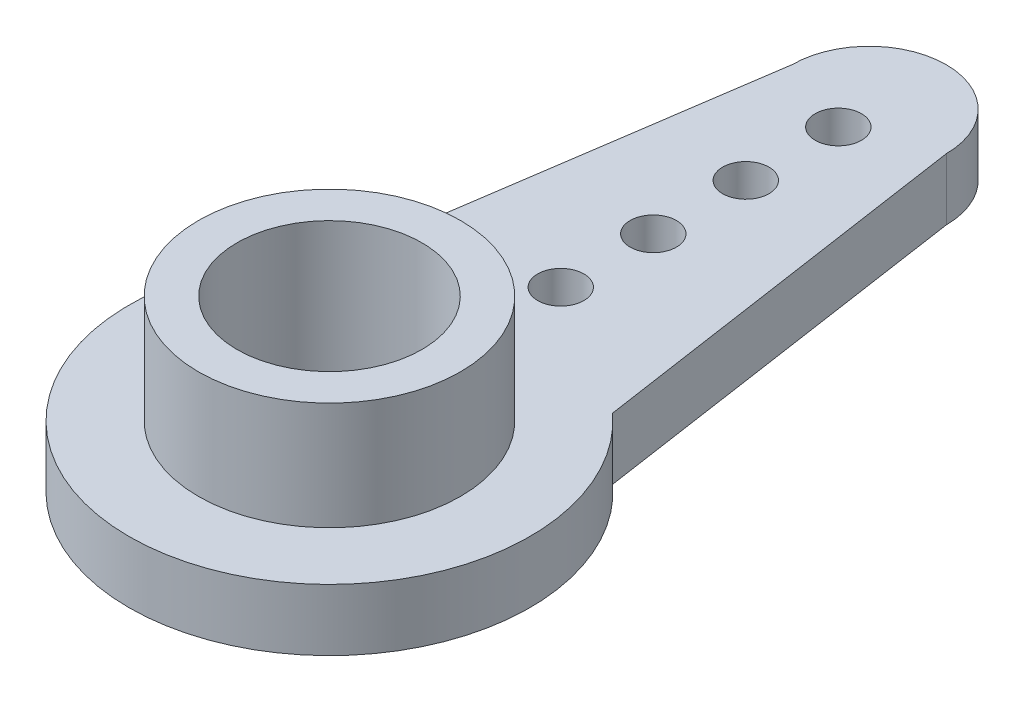
ISO-10303-21;
HEADER;
FILE_DESCRIPTION(('STEP AP214'),'2;1');
FILE_NAME('part.step','',(''),(''),'','','');
FILE_SCHEMA(('AUTOMOTIVE_DESIGN { 1 0 10303 214 1 1 1 1 }'));
ENDSEC;
DATA;
#1=APPLICATION_CONTEXT('core data for automotive mechanical design processes');
#2=APPLICATION_PROTOCOL_DEFINITION('international standard','automotive_design',2000,#1);
#3=PRODUCT_CONTEXT('',#1,'mechanical');
#4=PRODUCT('Part','Part','',(#3));
#5=PRODUCT_RELATED_PRODUCT_CATEGORY('part','',(#4));
#6=PRODUCT_DEFINITION_FORMATION('','',#4);
#7=PRODUCT_DEFINITION_CONTEXT('part definition',#1,'design');
#8=PRODUCT_DEFINITION('design','',#6,#7);
#9=PRODUCT_DEFINITION_SHAPE('','',#8);
#10=(LENGTH_UNIT() NAMED_UNIT(*) SI_UNIT(.MILLI.,.METRE.));
#11=(NAMED_UNIT(*) PLANE_ANGLE_UNIT() SI_UNIT($,.RADIAN.));
#12=(NAMED_UNIT(*) SI_UNIT($,.STERADIAN.) SOLID_ANGLE_UNIT());
#13=UNCERTAINTY_MEASURE_WITH_UNIT(LENGTH_MEASURE(1.E-05),#10,'distance_accuracy_value','');
#14=(GEOMETRIC_REPRESENTATION_CONTEXT(3) GLOBAL_UNCERTAINTY_ASSIGNED_CONTEXT((#13)) GLOBAL_UNIT_ASSIGNED_CONTEXT((#10,
#11,#12)) REPRESENTATION_CONTEXT('',''));
#15=CARTESIAN_POINT('',(0.,0.,0.));
#16=DIRECTION('',(0.,0.,1.));
#17=DIRECTION('',(1.,0.,0.));
#18=AXIS2_PLACEMENT_3D('',#15,#16,#17);
#19=CARTESIAN_POINT('',(0.,2.,-17.5));
#20=DIRECTION('',(0.,-1.,0.));
#21=DIRECTION('',(0.,0.,-1.));
#22=AXIS2_PLACEMENT_3D('',#19,#20,#21);
#23=CYLINDRICAL_SURFACE('',#22,2.5);
#24=CARTESIAN_POINT('',(0.,0.,-17.5));
#25=DIRECTION('',(0.,1.,0.));
#26=DIRECTION('',(0.,0.,1.));
#27=AXIS2_PLACEMENT_3D('',#24,#25,#26);
#28=CIRCLE('',#27,2.5);
#29=CARTESIAN_POINT('',(2.5,0.,-17.5));
#30=VERTEX_POINT('',#29);
#31=CARTESIAN_POINT('',(-2.5,0.,-17.5));
#32=VERTEX_POINT('',#31);
#33=EDGE_CURVE('E101',#30,#32,#28,.T.);
#34=ORIENTED_EDGE('',*,*,#33,.T.);
#35=DIRECTION('',(0.,-1.,0.));
#36=VECTOR('',#35,1.);
#37=CARTESIAN_POINT('',(-2.5,2.,-17.5));
#38=LINE('',#37,#36);
#39=CARTESIAN_POINT('',(-2.5,2.,-17.5));
#40=VERTEX_POINT('',#39);
#41=EDGE_CURVE('E11',#40,#32,#38,.T.);
#42=ORIENTED_EDGE('',*,*,#41,.F.);
#43=CARTESIAN_POINT('',(0.,2.,-17.5));
#44=DIRECTION('',(0.,1.,0.));
#45=DIRECTION('',(0.,0.,1.));
#46=AXIS2_PLACEMENT_3D('',#43,#44,#45);
#47=CIRCLE('',#46,2.5);
#48=CARTESIAN_POINT('',(2.5,2.,-17.5));
#49=VERTEX_POINT('',#48);
#50=EDGE_CURVE('E88',#49,#40,#47,.T.);
#51=ORIENTED_EDGE('',*,*,#50,.F.);
#52=DIRECTION('',(0.,-1.,0.));
#53=VECTOR('',#52,1.);
#54=CARTESIAN_POINT('',(2.5,2.,-17.5));
#55=LINE('',#54,#53);
#56=EDGE_CURVE('E97',#49,#30,#55,.T.);
#57=ORIENTED_EDGE('',*,*,#56,.T.);
#58=EDGE_LOOP('',(#34,#42,#51,#57));
#59=FACE_BOUND('',#58,.T.);
#60=ADVANCED_FACE('F35',(#59),#23,.T.);
#61=CARTESIAN_POINT('',(-2.5,2.,-17.5));
#62=DIRECTION('',(0.989264859075189,0.,0.14613363267553));
#63=DIRECTION('',(0.14613363267553,0.,-0.989264859075189));
#64=AXIS2_PLACEMENT_3D('',#61,#62,#63);
#65=PLANE('',#64);
#66=DIRECTION('',(-0.14613363267553,0.,0.989264859075189));
#67=VECTOR('',#66,1.);
#68=CARTESIAN_POINT('',(-2.5,0.,-17.5));
#69=LINE('',#68,#67);
#70=CARTESIAN_POINT('',(-4.37496528453029,0.,-4.807252724702));
#71=VERTEX_POINT('',#70);
#72=EDGE_CURVE('E92',#32,#71,#69,.T.);
#73=ORIENTED_EDGE('',*,*,#72,.T.);
#74=DIRECTION('',(0.,-1.,0.));
#75=VECTOR('',#74,1.);
#76=CARTESIAN_POINT('',(-4.37496528453029,2.,-4.807252724702));
#77=LINE('',#76,#75);
#78=CARTESIAN_POINT('',(-4.37496528453029,2.,-4.807252724702));
#79=VERTEX_POINT('',#78);
#80=EDGE_CURVE('E44',#79,#71,#77,.T.);
#81=ORIENTED_EDGE('',*,*,#80,.F.);
#82=DIRECTION('',(-0.14613363267553,0.,0.989264859075189));
#83=VECTOR('',#82,1.);
#84=CARTESIAN_POINT('',(-2.5,2.,-17.5));
#85=LINE('',#84,#83);
#86=EDGE_CURVE('E83',#40,#79,#85,.T.);
#87=ORIENTED_EDGE('',*,*,#86,.F.);
#88=ORIENTED_EDGE('',*,*,#41,.T.);
#89=EDGE_LOOP('',(#73,#81,#87,#88));
#90=FACE_BOUND('',#89,.T.);
#91=ADVANCED_FACE('F91',(#90),#65,.F.);
#92=CARTESIAN_POINT('',(0.,2.,0.));
#93=DIRECTION('',(0.,-1.,0.));
#94=DIRECTION('',(0.,0.,-1.));
#95=AXIS2_PLACEMENT_3D('',#92,#93,#94);
#96=CYLINDRICAL_SURFACE('',#95,6.5);
#97=CARTESIAN_POINT('',(0.,0.,0.));
#98=DIRECTION('',(0.,1.,0.));
#99=DIRECTION('',(0.,0.,1.));
#100=AXIS2_PLACEMENT_3D('',#97,#98,#99);
#101=CIRCLE('',#100,6.5);
#102=CARTESIAN_POINT('',(4.37496528453029,0.,-4.807252724702));
#103=VERTEX_POINT('',#102);
#104=EDGE_CURVE('E70',#71,#103,#101,.T.);
#105=ORIENTED_EDGE('',*,*,#104,.T.);
#106=DIRECTION('',(0.,-1.,0.));
#107=VECTOR('',#106,1.);
#108=CARTESIAN_POINT('',(4.37496528453029,2.,-4.807252724702));
#109=LINE('',#108,#107);
#110=CARTESIAN_POINT('',(4.37496528453029,2.,-4.807252724702));
#111=VERTEX_POINT('',#110);
#112=EDGE_CURVE('E93',#111,#103,#109,.T.);
#113=ORIENTED_EDGE('',*,*,#112,.F.);
#114=CARTESIAN_POINT('',(0.,2.,0.));
#115=DIRECTION('',(0.,1.,0.));
#116=DIRECTION('',(0.,0.,1.));
#117=AXIS2_PLACEMENT_3D('',#114,#115,#116);
#118=CIRCLE('',#117,6.5);
#119=EDGE_CURVE('E86',#79,#111,#118,.T.);
#120=ORIENTED_EDGE('',*,*,#119,.F.);
#121=ORIENTED_EDGE('',*,*,#80,.T.);
#122=EDGE_LOOP('',(#105,#113,#120,#121));
#123=FACE_BOUND('',#122,.T.);
#124=ADVANCED_FACE('F95',(#123),#96,.T.);
#125=CARTESIAN_POINT('',(2.5,2.,-17.5));
#126=DIRECTION('',(-0.989264859075189,0.,0.14613363267553));
#127=DIRECTION('',(0.14613363267553,0.,0.989264859075189));
#128=AXIS2_PLACEMENT_3D('',#125,#126,#127);
#129=PLANE('',#128);
#130=DIRECTION('',(-0.14613363267553,0.,-0.989264859075189));
#131=VECTOR('',#130,1.);
#132=CARTESIAN_POINT('',(2.5,0.,-17.5));
#133=LINE('',#132,#131);
#134=EDGE_CURVE('E76',#103,#30,#133,.T.);
#135=ORIENTED_EDGE('',*,*,#134,.T.);
#136=ORIENTED_EDGE('',*,*,#56,.F.);
#137=DIRECTION('',(-0.14613363267553,0.,-0.989264859075189));
#138=VECTOR('',#137,1.);
#139=CARTESIAN_POINT('',(2.5,2.,-17.5));
#140=LINE('',#139,#138);
#141=EDGE_CURVE('E53',#111,#49,#140,.T.);
#142=ORIENTED_EDGE('',*,*,#141,.F.);
#143=ORIENTED_EDGE('',*,*,#112,.T.);
#144=EDGE_LOOP('',(#135,#136,#142,#143));
#145=FACE_BOUND('',#144,.T.);
#146=ADVANCED_FACE('F158',(#145),#129,.F.);
#147=CARTESIAN_POINT('',(0.,2.,-17.5));
#148=DIRECTION('',(0.,1.,0.));
#149=DIRECTION('',(0.,0.,1.));
#150=AXIS2_PLACEMENT_3D('',#147,#148,#149);
#151=PLANE('',#150);
#152=CARTESIAN_POINT('',(0.,2.,-7.5));
#153=DIRECTION('',(0.,1.,0.));
#154=DIRECTION('',(0.,0.,1.));
#155=AXIS2_PLACEMENT_3D('',#152,#153,#154);
#156=CIRCLE('',#155,0.75);
#157=CARTESIAN_POINT('',(0.,2.,-6.75));
#158=VERTEX_POINT('',#157);
#159=EDGE_CURVE('E118',#158,#158,#156,.T.);
#160=ORIENTED_EDGE('',*,*,#159,.F.);
#161=EDGE_LOOP('',(#160));
#162=FACE_BOUND('',#161,.T.);
#163=CARTESIAN_POINT('',(0.,2.,-10.5));
#164=DIRECTION('',(0.,1.,0.));
#165=DIRECTION('',(0.,0.,1.));
#166=AXIS2_PLACEMENT_3D('',#163,#164,#165);
#167=CIRCLE('',#166,0.75);
#168=CARTESIAN_POINT('',(0.,2.,-9.75));
#169=VERTEX_POINT('',#168);
#170=EDGE_CURVE('E247',#169,#169,#167,.T.);
#171=ORIENTED_EDGE('',*,*,#170,.F.);
#172=EDGE_LOOP('',(#171));
#173=FACE_BOUND('',#172,.T.);
#174=CARTESIAN_POINT('',(0.,2.,-13.5));
#175=DIRECTION('',(0.,1.,0.));
#176=DIRECTION('',(0.,0.,1.));
#177=AXIS2_PLACEMENT_3D('',#174,#175,#176);
#178=CIRCLE('',#177,0.75);
#179=CARTESIAN_POINT('',(0.,2.,-12.75));
#180=VERTEX_POINT('',#179);
#181=EDGE_CURVE('E245',#180,#180,#178,.T.);
#182=ORIENTED_EDGE('',*,*,#181,.F.);
#183=EDGE_LOOP('',(#182));
#184=FACE_BOUND('',#183,.T.);
#185=CARTESIAN_POINT('',(0.,2.,-16.5));
#186=DIRECTION('',(0.,1.,0.));
#187=DIRECTION('',(0.,0.,1.));
#188=AXIS2_PLACEMENT_3D('',#185,#186,#187);
#189=CIRCLE('',#188,0.75);
#190=CARTESIAN_POINT('',(0.,2.,-15.75));
#191=VERTEX_POINT('',#190);
#192=EDGE_CURVE('E242',#191,#191,#189,.T.);
#193=ORIENTED_EDGE('',*,*,#192,.F.);
#194=EDGE_LOOP('',(#193));
#195=FACE_BOUND('',#194,.T.);
#196=CARTESIAN_POINT('',(0.,2.,0.));
#197=DIRECTION('',(0.,1.,0.));
#198=DIRECTION('',(0.,0.,1.));
#199=AXIS2_PLACEMENT_3D('',#196,#197,#198);
#200=CIRCLE('',#199,4.25);
#201=CARTESIAN_POINT('',(0.,2.,4.25));
#202=VERTEX_POINT('',#201);
#203=EDGE_CURVE('E235',#202,#202,#200,.T.);
#204=ORIENTED_EDGE('',*,*,#203,.F.);
#205=EDGE_LOOP('',(#204));
#206=FACE_BOUND('',#205,.T.);
#207=ORIENTED_EDGE('',*,*,#50,.T.);
#208=ORIENTED_EDGE('',*,*,#86,.T.);
#209=ORIENTED_EDGE('',*,*,#119,.T.);
#210=ORIENTED_EDGE('',*,*,#141,.T.);
#211=EDGE_LOOP('',(#207,#208,#209,#210));
#212=FACE_BOUND('',#211,.T.);
#213=ADVANCED_FACE('F84',(#162,#173,#184,#195,#206,#212),#151,.T.);
#214=CARTESIAN_POINT('',(0.,0.,-17.5));
#215=DIRECTION('',(0.,1.,0.));
#216=DIRECTION('',(0.,0.,1.));
#217=AXIS2_PLACEMENT_3D('',#214,#215,#216);
#218=PLANE('',#217);
#219=CARTESIAN_POINT('',(0.,0.,-7.5));
#220=DIRECTION('',(0.,1.,0.));
#221=DIRECTION('',(0.,0.,1.));
#222=AXIS2_PLACEMENT_3D('',#219,#220,#221);
#223=CIRCLE('',#222,0.75);
#224=CARTESIAN_POINT('',(0.,0.,-6.75));
#225=VERTEX_POINT('',#224);
#226=EDGE_CURVE('E38',#225,#225,#223,.T.);
#227=ORIENTED_EDGE('',*,*,#226,.T.);
#228=EDGE_LOOP('',(#227));
#229=FACE_BOUND('',#228,.T.);
#230=CARTESIAN_POINT('',(0.,0.,-10.5));
#231=DIRECTION('',(0.,1.,0.));
#232=DIRECTION('',(0.,0.,1.));
#233=AXIS2_PLACEMENT_3D('',#230,#231,#232);
#234=CIRCLE('',#233,0.75);
#235=CARTESIAN_POINT('',(0.,0.,-9.75));
#236=VERTEX_POINT('',#235);
#237=EDGE_CURVE('E120',#236,#236,#234,.T.);
#238=ORIENTED_EDGE('',*,*,#237,.T.);
#239=EDGE_LOOP('',(#238));
#240=FACE_BOUND('',#239,.T.);
#241=CARTESIAN_POINT('',(0.,0.,-13.5));
#242=DIRECTION('',(0.,1.,0.));
#243=DIRECTION('',(0.,0.,1.));
#244=AXIS2_PLACEMENT_3D('',#241,#242,#243);
#245=CIRCLE('',#244,0.75);
#246=CARTESIAN_POINT('',(0.,0.,-12.75));
#247=VERTEX_POINT('',#246);
#248=EDGE_CURVE('E117',#247,#247,#245,.T.);
#249=ORIENTED_EDGE('',*,*,#248,.T.);
#250=EDGE_LOOP('',(#249));
#251=FACE_BOUND('',#250,.T.);
#252=CARTESIAN_POINT('',(0.,0.,-16.5));
#253=DIRECTION('',(0.,1.,0.));
#254=DIRECTION('',(0.,0.,1.));
#255=AXIS2_PLACEMENT_3D('',#252,#253,#254);
#256=CIRCLE('',#255,0.75);
#257=CARTESIAN_POINT('',(0.,0.,-15.75));
#258=VERTEX_POINT('',#257);
#259=EDGE_CURVE('E114',#258,#258,#256,.T.);
#260=ORIENTED_EDGE('',*,*,#259,.T.);
#261=EDGE_LOOP('',(#260));
#262=FACE_BOUND('',#261,.T.);
#263=CARTESIAN_POINT('',(0.,0.,0.));
#264=DIRECTION('',(0.,1.,0.));
#265=DIRECTION('',(0.,0.,1.));
#266=AXIS2_PLACEMENT_3D('',#263,#264,#265);
#267=CIRCLE('',#266,3.);
#268=CARTESIAN_POINT('',(0.,0.,3.));
#269=VERTEX_POINT('',#268);
#270=EDGE_CURVE('E110',#269,#269,#267,.T.);
#271=ORIENTED_EDGE('',*,*,#270,.T.);
#272=EDGE_LOOP('',(#271));
#273=FACE_BOUND('',#272,.T.);
#274=ORIENTED_EDGE('',*,*,#33,.F.);
#275=ORIENTED_EDGE('',*,*,#134,.F.);
#276=ORIENTED_EDGE('',*,*,#104,.F.);
#277=ORIENTED_EDGE('',*,*,#72,.F.);
#278=EDGE_LOOP('',(#274,#275,#276,#277));
#279=FACE_BOUND('',#278,.T.);
#280=ADVANCED_FACE('F127',(#229,#240,#251,#262,#273,#279),#218,.F.);
#281=CARTESIAN_POINT('',(0.,5.5,0.));
#282=DIRECTION('',(0.,1.,0.));
#283=DIRECTION('',(0.,0.,1.));
#284=AXIS2_PLACEMENT_3D('',#281,#282,#283);
#285=PLANE('',#284);
#286=CARTESIAN_POINT('',(0.,5.5,0.));
#287=DIRECTION('',(0.,1.,0.));
#288=DIRECTION('',(0.,0.,1.));
#289=AXIS2_PLACEMENT_3D('',#286,#287,#288);
#290=CIRCLE('',#289,4.25);
#291=CARTESIAN_POINT('',(0.,5.5,4.25));
#292=VERTEX_POINT('',#291);
#293=EDGE_CURVE('E104',#292,#292,#290,.T.);
#294=ORIENTED_EDGE('',*,*,#293,.T.);
#295=EDGE_LOOP('',(#294));
#296=FACE_BOUND('',#295,.T.);
#297=CARTESIAN_POINT('',(0.,5.5,0.));
#298=DIRECTION('',(0.,1.,0.));
#299=DIRECTION('',(0.,0.,1.));
#300=AXIS2_PLACEMENT_3D('',#297,#298,#299);
#301=CIRCLE('',#300,3.);
#302=CARTESIAN_POINT('',(0.,5.5,3.));
#303=VERTEX_POINT('',#302);
#304=EDGE_CURVE('E113',#303,#303,#301,.T.);
#305=ORIENTED_EDGE('',*,*,#304,.F.);
#306=EDGE_LOOP('',(#305));
#307=FACE_BOUND('',#306,.T.);
#308=ADVANCED_FACE('F149',(#296,#307),#285,.T.);
#309=CARTESIAN_POINT('',(0.,5.5,0.));
#310=DIRECTION('',(0.,-1.,0.));
#311=DIRECTION('',(0.,0.,-1.));
#312=AXIS2_PLACEMENT_3D('',#309,#310,#311);
#313=CYLINDRICAL_SURFACE('',#312,4.25);
#314=ORIENTED_EDGE('',*,*,#293,.F.);
#315=EDGE_LOOP('',(#314));
#316=FACE_BOUND('',#315,.T.);
#317=ORIENTED_EDGE('',*,*,#203,.T.);
#318=EDGE_LOOP('',(#317));
#319=FACE_BOUND('',#318,.T.);
#320=ADVANCED_FACE('F155',(#316,#319),#313,.T.);
#321=CARTESIAN_POINT('',(0.,5.5,0.));
#322=DIRECTION('',(0.,-1.,0.));
#323=DIRECTION('',(0.,0.,-1.));
#324=AXIS2_PLACEMENT_3D('',#321,#322,#323);
#325=CYLINDRICAL_SURFACE('',#324,3.);
#326=ORIENTED_EDGE('',*,*,#304,.T.);
#327=EDGE_LOOP('',(#326));
#328=FACE_BOUND('',#327,.T.);
#329=ORIENTED_EDGE('',*,*,#270,.F.);
#330=EDGE_LOOP('',(#329));
#331=FACE_BOUND('',#330,.T.);
#332=ADVANCED_FACE('F185',(#328,#331),#325,.F.);
#333=CARTESIAN_POINT('',(0.,-1.5,-16.5));
#334=DIRECTION('',(0.,1.,0.));
#335=DIRECTION('',(0.,0.,1.));
#336=AXIS2_PLACEMENT_3D('',#333,#334,#335);
#337=CYLINDRICAL_SURFACE('',#336,0.75);
#338=ORIENTED_EDGE('',*,*,#192,.T.);
#339=EDGE_LOOP('',(#338));
#340=FACE_BOUND('',#339,.T.);
#341=ORIENTED_EDGE('',*,*,#259,.F.);
#342=EDGE_LOOP('',(#341));
#343=FACE_BOUND('',#342,.T.);
#344=ADVANCED_FACE('F195',(#340,#343),#337,.F.);
#345=CARTESIAN_POINT('',(0.,-1.5,-13.5));
#346=DIRECTION('',(0.,1.,0.));
#347=DIRECTION('',(0.,0.,1.));
#348=AXIS2_PLACEMENT_3D('',#345,#346,#347);
#349=CYLINDRICAL_SURFACE('',#348,0.75);
#350=ORIENTED_EDGE('',*,*,#181,.T.);
#351=EDGE_LOOP('',(#350));
#352=FACE_BOUND('',#351,.T.);
#353=ORIENTED_EDGE('',*,*,#248,.F.);
#354=EDGE_LOOP('',(#353));
#355=FACE_BOUND('',#354,.T.);
#356=ADVANCED_FACE('F137',(#352,#355),#349,.F.);
#357=CARTESIAN_POINT('',(0.,-1.5,-10.5));
#358=DIRECTION('',(0.,1.,0.));
#359=DIRECTION('',(0.,0.,1.));
#360=AXIS2_PLACEMENT_3D('',#357,#358,#359);
#361=CYLINDRICAL_SURFACE('',#360,0.75);
#362=ORIENTED_EDGE('',*,*,#170,.T.);
#363=EDGE_LOOP('',(#362));
#364=FACE_BOUND('',#363,.T.);
#365=ORIENTED_EDGE('',*,*,#237,.F.);
#366=EDGE_LOOP('',(#365));
#367=FACE_BOUND('',#366,.T.);
#368=ADVANCED_FACE('F131',(#364,#367),#361,.F.);
#369=CARTESIAN_POINT('',(0.,-1.5,-7.5));
#370=DIRECTION('',(0.,1.,0.));
#371=DIRECTION('',(0.,0.,1.));
#372=AXIS2_PLACEMENT_3D('',#369,#370,#371);
#373=CYLINDRICAL_SURFACE('',#372,0.75);
#374=ORIENTED_EDGE('',*,*,#159,.T.);
#375=EDGE_LOOP('',(#374));
#376=FACE_BOUND('',#375,.T.);
#377=ORIENTED_EDGE('',*,*,#226,.F.);
#378=EDGE_LOOP('',(#377));
#379=FACE_BOUND('',#378,.T.);
#380=ADVANCED_FACE('F129',(#376,#379),#373,.F.);
#381=CLOSED_SHELL('',(#60,#91,#124,#146,#213,#280,#308,#320,#332,#344,#356,#368,#380));
#382=MANIFOLD_SOLID_BREP('B2',#381);
#383=ADVANCED_BREP_SHAPE_REPRESENTATION('',(#18,#382),#14);
#384=SHAPE_DEFINITION_REPRESENTATION(#9,#383);
ENDSEC;
END-ISO-10303-21;
